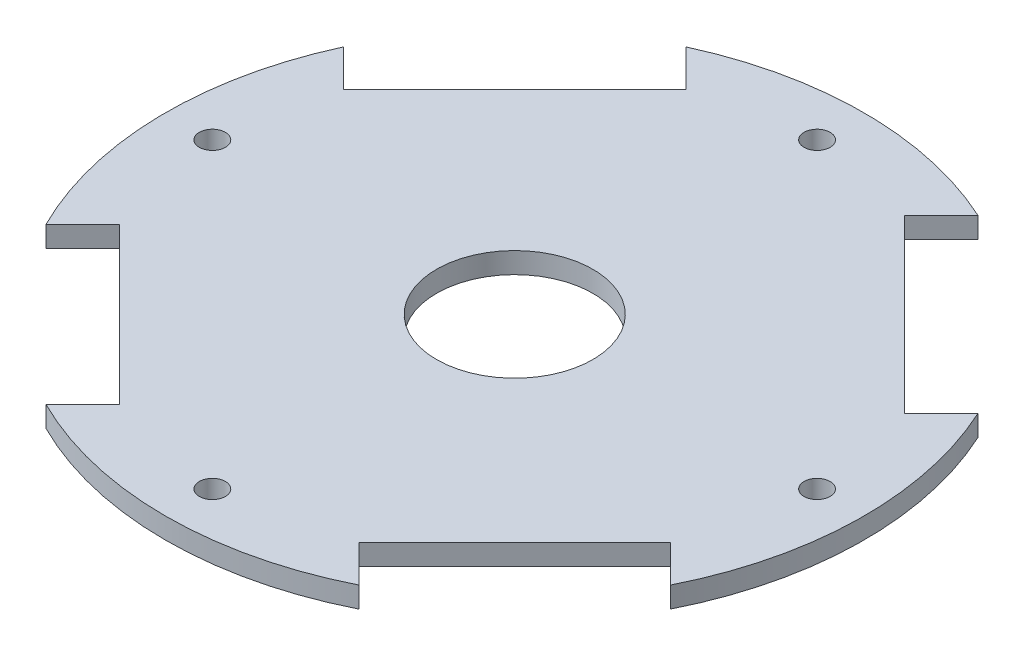
ISO-10303-21;
HEADER;
FILE_DESCRIPTION(('STEP AP214'),'2;1');
FILE_NAME('part.step','',(''),(''),'','','');
FILE_SCHEMA(('AUTOMOTIVE_DESIGN { 1 0 10303 214 1 1 1 1 }'));
ENDSEC;
DATA;
#1=APPLICATION_CONTEXT('core data for automotive mechanical design processes');
#2=APPLICATION_PROTOCOL_DEFINITION('international standard','automotive_design',2000,#1);
#3=PRODUCT_CONTEXT('',#1,'mechanical');
#4=PRODUCT('Part','Part','',(#3));
#5=PRODUCT_RELATED_PRODUCT_CATEGORY('part','',(#4));
#6=PRODUCT_DEFINITION_FORMATION('','',#4);
#7=PRODUCT_DEFINITION_CONTEXT('part definition',#1,'design');
#8=PRODUCT_DEFINITION('design','',#6,#7);
#9=PRODUCT_DEFINITION_SHAPE('','',#8);
#10=(LENGTH_UNIT() NAMED_UNIT(*) SI_UNIT(.MILLI.,.METRE.));
#11=(NAMED_UNIT(*) PLANE_ANGLE_UNIT() SI_UNIT($,.RADIAN.));
#12=(NAMED_UNIT(*) SI_UNIT($,.STERADIAN.) SOLID_ANGLE_UNIT());
#13=UNCERTAINTY_MEASURE_WITH_UNIT(LENGTH_MEASURE(1.E-05),#10,'distance_accuracy_value','');
#14=(GEOMETRIC_REPRESENTATION_CONTEXT(3) GLOBAL_UNCERTAINTY_ASSIGNED_CONTEXT((#13)) GLOBAL_UNIT_ASSIGNED_CONTEXT((#10,
#11,#12)) REPRESENTATION_CONTEXT('',''));
#15=CARTESIAN_POINT('',(0.,0.,0.));
#16=DIRECTION('',(0.,0.,1.));
#17=DIRECTION('',(1.,0.,0.));
#18=AXIS2_PLACEMENT_3D('',#15,#16,#17);
#19=CARTESIAN_POINT('',(0.,4.,0.));
#20=DIRECTION('',(0.,-1.,0.));
#21=DIRECTION('',(0.,0.,-1.));
#22=AXIS2_PLACEMENT_3D('',#19,#20,#21);
#23=CYLINDRICAL_SURFACE('',#22,67.);
#24=CARTESIAN_POINT('',(0.,0.,0.));
#25=DIRECTION('',(0.,1.,0.));
#26=DIRECTION('',(0.,0.,1.));
#27=AXIS2_PLACEMENT_3D('',#24,#25,#26);
#28=CIRCLE('',#27,67.);
#29=CARTESIAN_POINT('',(59.9082632030006,0.,30.));
#30=VERTEX_POINT('',#29);
#31=CARTESIAN_POINT('',(60.868711174132,0.,-28.0000000000006));
#32=VERTEX_POINT('',#31);
#33=EDGE_CURVE('E265',#30,#32,#28,.T.);
#34=ORIENTED_EDGE('',*,*,#33,.T.);
#35=DIRECTION('',(0.,-1.,0.));
#36=VECTOR('',#35,1.);
#37=CARTESIAN_POINT('',(60.868711174132,10.,-28.0000000000006));
#38=LINE('',#37,#36);
#39=CARTESIAN_POINT('',(60.868711174132,4.,-28.0000000000006));
#40=VERTEX_POINT('',#39);
#41=EDGE_CURVE('E211',#40,#32,#38,.T.);
#42=ORIENTED_EDGE('',*,*,#41,.F.);
#43=CARTESIAN_POINT('',(0.,4.,0.));
#44=DIRECTION('',(0.,1.,0.));
#45=DIRECTION('',(0.,0.,1.));
#46=AXIS2_PLACEMENT_3D('',#43,#44,#45);
#47=CIRCLE('',#46,67.);
#48=CARTESIAN_POINT('',(59.9082632030006,4.,30.));
#49=VERTEX_POINT('',#48);
#50=EDGE_CURVE('E11',#49,#40,#47,.T.);
#51=ORIENTED_EDGE('',*,*,#50,.F.);
#52=DIRECTION('',(0.,-1.,0.));
#53=VECTOR('',#52,1.);
#54=CARTESIAN_POINT('',(59.9082632030006,10.,30.));
#55=LINE('',#54,#53);
#56=EDGE_CURVE('E223',#49,#30,#55,.T.);
#57=ORIENTED_EDGE('',*,*,#56,.T.);
#58=EDGE_LOOP('',(#34,#42,#51,#57));
#59=FACE_BOUND('',#58,.T.);
#60=ADVANCED_FACE('F37',(#59),#23,.T.);
#61=CARTESIAN_POINT('',(-30.,4.,59.9082632030006));
#62=VERTEX_POINT('',#61);
#63=CARTESIAN_POINT('',(30.,4.,59.9082632030006));
#64=VERTEX_POINT('',#63);
#65=EDGE_CURVE('E48',#62,#64,#47,.T.);
#66=ORIENTED_EDGE('',*,*,#65,.F.);
#67=DIRECTION('',(0.,-1.,0.));
#68=VECTOR('',#67,1.);
#69=CARTESIAN_POINT('',(-30.,10.,59.9082632030006));
#70=LINE('',#69,#68);
#71=CARTESIAN_POINT('',(-30.,0.,59.9082632030006));
#72=VERTEX_POINT('',#71);
#73=EDGE_CURVE('E195',#62,#72,#70,.T.);
#74=ORIENTED_EDGE('',*,*,#73,.T.);
#75=CARTESIAN_POINT('',(30.,0.,59.9082632030006));
#76=VERTEX_POINT('',#75);
#77=EDGE_CURVE('E41',#72,#76,#28,.T.);
#78=ORIENTED_EDGE('',*,*,#77,.T.);
#79=DIRECTION('',(0.,-1.,0.));
#80=VECTOR('',#79,1.);
#81=CARTESIAN_POINT('',(30.,10.,59.9082632030006));
#82=LINE('',#81,#80);
#83=EDGE_CURVE('E222',#64,#76,#82,.T.);
#84=ORIENTED_EDGE('',*,*,#83,.F.);
#85=EDGE_LOOP('',(#66,#74,#78,#84));
#86=FACE_BOUND('',#85,.T.);
#87=ADVANCED_FACE('F349',(#86),#23,.T.);
#88=CARTESIAN_POINT('',(-60.8687111741334,0.,-27.9999999999987));
#89=VERTEX_POINT('',#88);
#90=CARTESIAN_POINT('',(-59.9082632030006,0.,30.));
#91=VERTEX_POINT('',#90);
#92=EDGE_CURVE('E181',#89,#91,#28,.T.);
#93=ORIENTED_EDGE('',*,*,#92,.T.);
#94=DIRECTION('',(0.,-1.,0.));
#95=VECTOR('',#94,1.);
#96=CARTESIAN_POINT('',(-59.9082632030006,10.,30.));
#97=LINE('',#96,#95);
#98=CARTESIAN_POINT('',(-59.9082632030006,4.,30.));
#99=VERTEX_POINT('',#98);
#100=EDGE_CURVE('E63',#99,#91,#97,.T.);
#101=ORIENTED_EDGE('',*,*,#100,.F.);
#102=CARTESIAN_POINT('',(-60.8687111741334,4.,-27.9999999999987));
#103=VERTEX_POINT('',#102);
#104=EDGE_CURVE('E275',#103,#99,#47,.T.);
#105=ORIENTED_EDGE('',*,*,#104,.F.);
#106=DIRECTION('',(0.,-1.,0.));
#107=VECTOR('',#106,1.);
#108=CARTESIAN_POINT('',(-60.8687111741334,10.,-27.9999999999987));
#109=LINE('',#108,#107);
#110=EDGE_CURVE('E175',#103,#89,#109,.T.);
#111=ORIENTED_EDGE('',*,*,#110,.T.);
#112=EDGE_LOOP('',(#93,#101,#105,#111));
#113=FACE_BOUND('',#112,.T.);
#114=ADVANCED_FACE('F313',(#113),#23,.T.);
#115=CARTESIAN_POINT('',(2.23779328401008E-12,4.,-58.0000000000016));
#116=DIRECTION('',(0.,-1.,0.));
#117=DIRECTION('',(0.,0.,-1.));
#118=AXIS2_PLACEMENT_3D('',#115,#116,#117);
#119=CYLINDRICAL_SURFACE('',#118,2.49999999999738);
#120=CARTESIAN_POINT('',(2.23779328401008E-12,4.,-58.0000000000016));
#121=DIRECTION('',(0.,1.,0.));
#122=DIRECTION('',(0.,0.,1.));
#123=AXIS2_PLACEMENT_3D('',#120,#121,#122);
#124=CIRCLE('',#123,2.49999999999738);
#125=CARTESIAN_POINT('',(2.23779328401008E-12,4.,-55.5000000000043));
#126=VERTEX_POINT('',#125);
#127=EDGE_CURVE('E271',#126,#126,#124,.T.);
#128=ORIENTED_EDGE('',*,*,#127,.T.);
#129=EDGE_LOOP('',(#128));
#130=FACE_BOUND('',#129,.T.);
#131=CARTESIAN_POINT('',(2.23779328401008E-12,0.,-58.0000000000016));
#132=DIRECTION('',(0.,1.,0.));
#133=DIRECTION('',(0.,0.,1.));
#134=AXIS2_PLACEMENT_3D('',#131,#132,#133);
#135=CIRCLE('',#134,2.49999999999738);
#136=CARTESIAN_POINT('',(2.23779328401008E-12,0.,-55.5000000000043));
#137=VERTEX_POINT('',#136);
#138=EDGE_CURVE('E283',#137,#137,#135,.T.);
#139=ORIENTED_EDGE('',*,*,#138,.F.);
#140=EDGE_LOOP('',(#139));
#141=FACE_BOUND('',#140,.T.);
#142=ADVANCED_FACE('F382',(#130,#141),#119,.F.);
#143=CARTESIAN_POINT('',(58.0000000000033,4.,6.00214322687975E-13));
#144=DIRECTION('',(0.,-1.,0.));
#145=DIRECTION('',(0.,0.,-1.));
#146=AXIS2_PLACEMENT_3D('',#143,#144,#145);
#147=CYLINDRICAL_SURFACE('',#146,2.49999999999867);
#148=CARTESIAN_POINT('',(58.0000000000033,4.,6.00214322687975E-13));
#149=DIRECTION('',(0.,1.,0.));
#150=DIRECTION('',(0.,0.,1.));
#151=AXIS2_PLACEMENT_3D('',#148,#149,#150);
#152=CIRCLE('',#151,2.49999999999867);
#153=CARTESIAN_POINT('',(58.0000000000033,4.,2.49999999999927));
#154=VERTEX_POINT('',#153);
#155=EDGE_CURVE('E268',#154,#154,#152,.T.);
#156=ORIENTED_EDGE('',*,*,#155,.T.);
#157=EDGE_LOOP('',(#156));
#158=FACE_BOUND('',#157,.T.);
#159=CARTESIAN_POINT('',(58.0000000000033,0.,6.00214322687975E-13));
#160=DIRECTION('',(0.,1.,0.));
#161=DIRECTION('',(0.,0.,1.));
#162=AXIS2_PLACEMENT_3D('',#159,#160,#161);
#163=CIRCLE('',#162,2.49999999999867);
#164=CARTESIAN_POINT('',(58.0000000000033,0.,2.49999999999927));
#165=VERTEX_POINT('',#164);
#166=EDGE_CURVE('E281',#165,#165,#163,.T.);
#167=ORIENTED_EDGE('',*,*,#166,.F.);
#168=EDGE_LOOP('',(#167));
#169=FACE_BOUND('',#168,.T.);
#170=ADVANCED_FACE('F386',(#158,#169),#147,.F.);
#171=CARTESIAN_POINT('',(1.03736463863413E-12,4.,58.0000000000016));
#172=DIRECTION('',(0.,-1.,0.));
#173=DIRECTION('',(0.,0.,-1.));
#174=AXIS2_PLACEMENT_3D('',#171,#172,#173);
#175=CYLINDRICAL_SURFACE('',#174,2.5000000000009);
#176=CARTESIAN_POINT('',(1.03736463863413E-12,4.,58.0000000000016));
#177=DIRECTION('',(0.,1.,0.));
#178=DIRECTION('',(0.,0.,1.));
#179=AXIS2_PLACEMENT_3D('',#176,#177,#178);
#180=CIRCLE('',#179,2.5000000000009);
#181=CARTESIAN_POINT('',(1.03736463863413E-12,4.,60.5000000000025));
#182=VERTEX_POINT('',#181);
#183=EDGE_CURVE('E264',#182,#182,#180,.T.);
#184=ORIENTED_EDGE('',*,*,#183,.T.);
#185=EDGE_LOOP('',(#184));
#186=FACE_BOUND('',#185,.T.);
#187=CARTESIAN_POINT('',(1.03736463863413E-12,0.,58.0000000000016));
#188=DIRECTION('',(0.,1.,0.));
#189=DIRECTION('',(0.,0.,1.));
#190=AXIS2_PLACEMENT_3D('',#187,#188,#189);
#191=CIRCLE('',#190,2.5000000000009);
#192=CARTESIAN_POINT('',(1.03736463863413E-12,0.,60.5000000000025));
#193=VERTEX_POINT('',#192);
#194=EDGE_CURVE('E278',#193,#193,#191,.T.);
#195=ORIENTED_EDGE('',*,*,#194,.F.);
#196=EDGE_LOOP('',(#195));
#197=FACE_BOUND('',#196,.T.);
#198=ADVANCED_FACE('F380',(#186,#197),#175,.F.);
#199=CARTESIAN_POINT('',(-58.,4.,-6.07153216591882E-13));
#200=DIRECTION('',(0.,-1.,0.));
#201=DIRECTION('',(0.,0.,-1.));
#202=AXIS2_PLACEMENT_3D('',#199,#200,#201);
#203=CYLINDRICAL_SURFACE('',#202,2.5);
#204=CARTESIAN_POINT('',(-58.,4.,-6.07153216591882E-13));
#205=DIRECTION('',(0.,1.,0.));
#206=DIRECTION('',(0.,0.,1.));
#207=AXIS2_PLACEMENT_3D('',#204,#205,#206);
#208=CIRCLE('',#207,2.5);
#209=CARTESIAN_POINT('',(-58.,4.,2.49999999999939));
#210=VERTEX_POINT('',#209);
#211=EDGE_CURVE('E261',#210,#210,#208,.T.);
#212=ORIENTED_EDGE('',*,*,#211,.T.);
#213=EDGE_LOOP('',(#212));
#214=FACE_BOUND('',#213,.T.);
#215=CARTESIAN_POINT('',(-58.,0.,-6.07153216591882E-13));
#216=DIRECTION('',(0.,1.,0.));
#217=DIRECTION('',(0.,0.,1.));
#218=AXIS2_PLACEMENT_3D('',#215,#216,#217);
#219=CIRCLE('',#218,2.5);
#220=CARTESIAN_POINT('',(-58.,0.,2.49999999999939));
#221=VERTEX_POINT('',#220);
#222=EDGE_CURVE('E258',#221,#221,#219,.T.);
#223=ORIENTED_EDGE('',*,*,#222,.F.);
#224=EDGE_LOOP('',(#223));
#225=FACE_BOUND('',#224,.T.);
#226=ADVANCED_FACE('F39',(#214,#225),#203,.F.);
#227=CARTESIAN_POINT('',(27.9999999999987,4.,-60.8687111741334));
#228=VERTEX_POINT('',#227);
#229=CARTESIAN_POINT('',(-28.0000000000013,4.,-60.8687111741322));
#230=VERTEX_POINT('',#229);
#231=EDGE_CURVE('E46',#228,#230,#47,.T.);
#232=ORIENTED_EDGE('',*,*,#231,.F.);
#233=DIRECTION('',(0.,-1.,0.));
#234=VECTOR('',#233,1.);
#235=CARTESIAN_POINT('',(27.9999999999987,10.,-60.8687111741334));
#236=LINE('',#235,#234);
#237=CARTESIAN_POINT('',(27.9999999999987,0.,-60.8687111741334));
#238=VERTEX_POINT('',#237);
#239=EDGE_CURVE('E208',#228,#238,#236,.T.);
#240=ORIENTED_EDGE('',*,*,#239,.T.);
#241=CARTESIAN_POINT('',(-28.0000000000013,0.,-60.8687111741322));
#242=VERTEX_POINT('',#241);
#243=EDGE_CURVE('E291',#238,#242,#28,.T.);
#244=ORIENTED_EDGE('',*,*,#243,.T.);
#245=DIRECTION('',(0.,-1.,0.));
#246=VECTOR('',#245,1.);
#247=CARTESIAN_POINT('',(-28.0000000000013,10.,-60.8687111741322));
#248=LINE('',#247,#246);
#249=EDGE_CURVE('E302',#230,#242,#248,.T.);
#250=ORIENTED_EDGE('',*,*,#249,.F.);
#251=EDGE_LOOP('',(#232,#240,#244,#250));
#252=FACE_BOUND('',#251,.T.);
#253=ADVANCED_FACE('F301',(#252),#23,.T.);
#254=CARTESIAN_POINT('',(0.,4.,0.));
#255=DIRECTION('',(0.,1.,0.));
#256=DIRECTION('',(0.,0.,1.));
#257=AXIS2_PLACEMENT_3D('',#254,#255,#256);
#258=PLANE('',#257);
#259=DIRECTION('',(0.707106781186501,0.,-0.707106781186594));
#260=VECTOR('',#259,1.);
#261=CARTESIAN_POINT('',(16.4343555870696,4.,16.4343555870674));
#262=LINE('',#261,#260);
#263=CARTESIAN_POINT('',(53.7976433622672,4.,-20.9289321881351));
#264=VERTEX_POINT('',#263);
#265=EDGE_CURVE('E252',#264,#40,#262,.T.);
#266=ORIENTED_EDGE('',*,*,#265,.F.);
#267=DIRECTION('',(0.707106781186547,0.,0.707106781186548));
#268=VECTOR('',#267,1.);
#269=CARTESIAN_POINT('',(37.3632877752012,4.,-37.3632877752011));
#270=LINE('',#269,#268);
#271=CARTESIAN_POINT('',(20.9289321881338,4.,-53.7976433622685));
#272=VERTEX_POINT('',#271);
#273=EDGE_CURVE('E248',#272,#264,#270,.T.);
#274=ORIENTED_EDGE('',*,*,#273,.F.);
#275=DIRECTION('',(-0.707106781186547,0.,0.707106781186548));
#276=VECTOR('',#275,1.);
#277=CARTESIAN_POINT('',(-16.4343555870673,4.,-16.4343555870673));
#278=LINE('',#277,#276);
#279=EDGE_CURVE('E250',#228,#272,#278,.T.);
#280=ORIENTED_EDGE('',*,*,#279,.F.);
#281=ORIENTED_EDGE('',*,*,#231,.T.);
#282=DIRECTION('',(-0.707106781186562,0.,-0.707106781186533));
#283=VECTOR('',#282,1.);
#284=CARTESIAN_POINT('',(16.434355587066,4.,-16.4343555870667));
#285=LINE('',#284,#283);
#286=CARTESIAN_POINT('',(-20.9289321881357,4.,-53.7976433622669));
#287=VERTEX_POINT('',#286);
#288=EDGE_CURVE('E237',#287,#230,#285,.T.);
#289=ORIENTED_EDGE('',*,*,#288,.F.);
#290=DIRECTION('',(0.707106781186547,0.,-0.707106781186548));
#291=VECTOR('',#290,1.);
#292=CARTESIAN_POINT('',(-37.3632877752013,4.,-37.3632877752013));
#293=LINE('',#292,#291);
#294=CARTESIAN_POINT('',(-53.7976433622686,4.,-20.9289321881339));
#295=VERTEX_POINT('',#294);
#296=EDGE_CURVE('E239',#295,#287,#293,.T.);
#297=ORIENTED_EDGE('',*,*,#296,.F.);
#298=DIRECTION('',(0.707106781186548,0.,0.707106781186548));
#299=VECTOR('',#298,1.);
#300=CARTESIAN_POINT('',(-16.4343555870673,4.,16.4343555870673));
#301=LINE('',#300,#299);
#302=EDGE_CURVE('E161',#103,#295,#301,.T.);
#303=ORIENTED_EDGE('',*,*,#302,.F.);
#304=ORIENTED_EDGE('',*,*,#104,.T.);
#305=DIRECTION('',(-0.707106781186548,0.,0.707106781186548));
#306=VECTOR('',#305,1.);
#307=CARTESIAN_POINT('',(-14.9541316015003,4.,-14.9541316015003));
#308=LINE('',#307,#306);
#309=CARTESIAN_POINT('',(-52.8371953911352,4.,22.9289321881345));
#310=VERTEX_POINT('',#309);
#311=EDGE_CURVE('E242',#310,#99,#308,.T.);
#312=ORIENTED_EDGE('',*,*,#311,.F.);
#313=DIRECTION('',(-0.707106781186548,0.,-0.707106781186547));
#314=VECTOR('',#313,1.);
#315=CARTESIAN_POINT('',(-37.8830637896348,4.,37.8830637896349));
#316=LINE('',#315,#314);
#317=CARTESIAN_POINT('',(-22.9289321881345,4.,52.8371953911352));
#318=VERTEX_POINT('',#317);
#319=EDGE_CURVE('E244',#318,#310,#316,.T.);
#320=ORIENTED_EDGE('',*,*,#319,.F.);
#321=DIRECTION('',(0.707106781186548,0.,-0.707106781186547));
#322=VECTOR('',#321,1.);
#323=CARTESIAN_POINT('',(14.9541316015003,4.,14.9541316015003));
#324=LINE('',#323,#322);
#325=EDGE_CURVE('E246',#62,#318,#324,.T.);
#326=ORIENTED_EDGE('',*,*,#325,.F.);
#327=ORIENTED_EDGE('',*,*,#65,.T.);
#328=DIRECTION('',(0.707106781186547,0.,0.707106781186548));
#329=VECTOR('',#328,1.);
#330=CARTESIAN_POINT('',(-14.9541316015003,4.,14.9541316015003));
#331=LINE('',#330,#329);
#332=CARTESIAN_POINT('',(22.9289321881345,4.,52.8371953911352));
#333=VERTEX_POINT('',#332);
#334=EDGE_CURVE('E226',#333,#64,#331,.T.);
#335=ORIENTED_EDGE('',*,*,#334,.F.);
#336=DIRECTION('',(-0.707106781186548,0.,0.707106781186548));
#337=VECTOR('',#336,1.);
#338=CARTESIAN_POINT('',(37.8830637896348,4.,37.8830637896348));
#339=LINE('',#338,#337);
#340=CARTESIAN_POINT('',(52.8371953911352,4.,22.9289321881345));
#341=VERTEX_POINT('',#340);
#342=EDGE_CURVE('E233',#341,#333,#339,.T.);
#343=ORIENTED_EDGE('',*,*,#342,.F.);
#344=DIRECTION('',(-0.707106781186548,0.,-0.707106781186548));
#345=VECTOR('',#344,1.);
#346=CARTESIAN_POINT('',(14.9541316015003,4.,-14.9541316015003));
#347=LINE('',#346,#345);
#348=EDGE_CURVE('E235',#49,#341,#347,.T.);
#349=ORIENTED_EDGE('',*,*,#348,.F.);
#350=ORIENTED_EDGE('',*,*,#50,.T.);
#351=EDGE_LOOP('',(#266,#274,#280,#281,#289,#297,#303,#304,#312,#320,#326,#327,#335,#343,#349,#350));
#352=FACE_BOUND('',#351,.T.);
#353=CARTESIAN_POINT('',(0.,4.,0.));
#354=DIRECTION('',(0.,1.,0.));
#355=DIRECTION('',(0.,0.,1.));
#356=AXIS2_PLACEMENT_3D('',#353,#354,#355);
#357=CIRCLE('',#356,15.);
#358=CARTESIAN_POINT('',(0.,4.,15.));
#359=VERTEX_POINT('',#358);
#360=EDGE_CURVE('E254',#359,#359,#357,.T.);
#361=ORIENTED_EDGE('',*,*,#360,.F.);
#362=EDGE_LOOP('',(#361));
#363=FACE_BOUND('',#362,.T.);
#364=ORIENTED_EDGE('',*,*,#211,.F.);
#365=EDGE_LOOP('',(#364));
#366=FACE_BOUND('',#365,.T.);
#367=ORIENTED_EDGE('',*,*,#183,.F.);
#368=EDGE_LOOP('',(#367));
#369=FACE_BOUND('',#368,.T.);
#370=ORIENTED_EDGE('',*,*,#155,.F.);
#371=EDGE_LOOP('',(#370));
#372=FACE_BOUND('',#371,.T.);
#373=ORIENTED_EDGE('',*,*,#127,.F.);
#374=EDGE_LOOP('',(#373));
#375=FACE_BOUND('',#374,.T.);
#376=ADVANCED_FACE('F317',(#352,#363,#366,#369,#372,#375),#258,.T.);
#377=CARTESIAN_POINT('',(0.,0.,0.));
#378=DIRECTION('',(0.,1.,0.));
#379=DIRECTION('',(0.,0.,1.));
#380=AXIS2_PLACEMENT_3D('',#377,#378,#379);
#381=PLANE('',#380);
#382=CARTESIAN_POINT('',(0.,0.,0.));
#383=DIRECTION('',(0.,1.,0.));
#384=DIRECTION('',(0.,0.,1.));
#385=AXIS2_PLACEMENT_3D('',#382,#383,#384);
#386=CIRCLE('',#385,15.);
#387=CARTESIAN_POINT('',(0.,0.,15.));
#388=VERTEX_POINT('',#387);
#389=EDGE_CURVE('E255',#388,#388,#386,.T.);
#390=ORIENTED_EDGE('',*,*,#389,.T.);
#391=EDGE_LOOP('',(#390));
#392=FACE_BOUND('',#391,.T.);
#393=ORIENTED_EDGE('',*,*,#222,.T.);
#394=EDGE_LOOP('',(#393));
#395=FACE_BOUND('',#394,.T.);
#396=ORIENTED_EDGE('',*,*,#194,.T.);
#397=EDGE_LOOP('',(#396));
#398=FACE_BOUND('',#397,.T.);
#399=ORIENTED_EDGE('',*,*,#166,.T.);
#400=EDGE_LOOP('',(#399));
#401=FACE_BOUND('',#400,.T.);
#402=ORIENTED_EDGE('',*,*,#138,.T.);
#403=EDGE_LOOP('',(#402));
#404=FACE_BOUND('',#403,.T.);
#405=DIRECTION('',(-0.707106781186547,0.,-0.707106781186548));
#406=VECTOR('',#405,1.);
#407=CARTESIAN_POINT('',(53.7976433622672,0.,-20.9289321881351));
#408=LINE('',#407,#406);
#409=CARTESIAN_POINT('',(53.7976433622672,0.,-20.9289321881351));
#410=VERTEX_POINT('',#409);
#411=CARTESIAN_POINT('',(20.9289321881338,0.,-53.7976433622685));
#412=VERTEX_POINT('',#411);
#413=EDGE_CURVE('E214',#410,#412,#408,.T.);
#414=ORIENTED_EDGE('',*,*,#413,.F.);
#415=DIRECTION('',(-0.707106781186501,0.,0.707106781186594));
#416=VECTOR('',#415,1.);
#417=CARTESIAN_POINT('',(60.8687111741316,0.,-28.0000000000005));
#418=LINE('',#417,#416);
#419=EDGE_CURVE('E55',#32,#410,#418,.T.);
#420=ORIENTED_EDGE('',*,*,#419,.F.);
#421=ORIENTED_EDGE('',*,*,#33,.F.);
#422=DIRECTION('',(0.707106781186547,0.,0.707106781186547));
#423=VECTOR('',#422,1.);
#424=CARTESIAN_POINT('',(59.9082632030006,0.,30.));
#425=LINE('',#424,#423);
#426=CARTESIAN_POINT('',(52.8371953911352,0.,22.9289321881345));
#427=VERTEX_POINT('',#426);
#428=EDGE_CURVE('E220',#427,#30,#425,.T.);
#429=ORIENTED_EDGE('',*,*,#428,.F.);
#430=DIRECTION('',(0.707106781186548,0.,-0.707106781186548));
#431=VECTOR('',#430,1.);
#432=CARTESIAN_POINT('',(52.8371953911352,0.,22.9289321881345));
#433=LINE('',#432,#431);
#434=CARTESIAN_POINT('',(22.9289321881345,0.,52.8371953911352));
#435=VERTEX_POINT('',#434);
#436=EDGE_CURVE('E185',#435,#427,#433,.T.);
#437=ORIENTED_EDGE('',*,*,#436,.F.);
#438=DIRECTION('',(-0.707106781186547,0.,-0.707106781186548));
#439=VECTOR('',#438,1.);
#440=CARTESIAN_POINT('',(30.,0.,59.9082632030006));
#441=LINE('',#440,#439);
#442=EDGE_CURVE('E182',#76,#435,#441,.T.);
#443=ORIENTED_EDGE('',*,*,#442,.F.);
#444=ORIENTED_EDGE('',*,*,#77,.F.);
#445=DIRECTION('',(-0.707106781186548,0.,0.707106781186547));
#446=VECTOR('',#445,1.);
#447=CARTESIAN_POINT('',(-30.,0.,59.9082632030006));
#448=LINE('',#447,#446);
#449=CARTESIAN_POINT('',(-22.9289321881345,0.,52.8371953911352));
#450=VERTEX_POINT('',#449);
#451=EDGE_CURVE('E190',#450,#72,#448,.T.);
#452=ORIENTED_EDGE('',*,*,#451,.F.);
#453=DIRECTION('',(0.707106781186548,0.,0.707106781186547));
#454=VECTOR('',#453,1.);
#455=CARTESIAN_POINT('',(-52.8371953911352,0.,22.9289321881345));
#456=LINE('',#455,#454);
#457=CARTESIAN_POINT('',(-52.8371953911352,0.,22.9289321881345));
#458=VERTEX_POINT('',#457);
#459=EDGE_CURVE('E199',#458,#450,#456,.T.);
#460=ORIENTED_EDGE('',*,*,#459,.F.);
#461=DIRECTION('',(0.707106781186547,0.,-0.707106781186547));
#462=VECTOR('',#461,1.);
#463=CARTESIAN_POINT('',(-59.9082632030006,0.,30.));
#464=LINE('',#463,#462);
#465=EDGE_CURVE('E165',#91,#458,#464,.T.);
#466=ORIENTED_EDGE('',*,*,#465,.F.);
#467=ORIENTED_EDGE('',*,*,#92,.F.);
#468=DIRECTION('',(-0.707106781186548,0.,-0.707106781186548));
#469=VECTOR('',#468,1.);
#470=CARTESIAN_POINT('',(-60.8687111741334,0.,-27.9999999999987));
#471=LINE('',#470,#469);
#472=CARTESIAN_POINT('',(-53.7976433622686,0.,-20.9289321881339));
#473=VERTEX_POINT('',#472);
#474=EDGE_CURVE('E158',#473,#89,#471,.T.);
#475=ORIENTED_EDGE('',*,*,#474,.F.);
#476=DIRECTION('',(-0.707106781186547,0.,0.707106781186548));
#477=VECTOR('',#476,1.);
#478=CARTESIAN_POINT('',(-53.7976433622686,0.,-20.9289321881339));
#479=LINE('',#478,#477);
#480=CARTESIAN_POINT('',(-20.9289321881357,0.,-53.7976433622669));
#481=VERTEX_POINT('',#480);
#482=EDGE_CURVE('E168',#481,#473,#479,.T.);
#483=ORIENTED_EDGE('',*,*,#482,.F.);
#484=DIRECTION('',(0.707106781186562,0.,0.707106781186533));
#485=VECTOR('',#484,1.);
#486=CARTESIAN_POINT('',(-28.0000000000013,0.,-60.8687111741322));
#487=LINE('',#486,#485);
#488=EDGE_CURVE('E174',#242,#481,#487,.T.);
#489=ORIENTED_EDGE('',*,*,#488,.F.);
#490=ORIENTED_EDGE('',*,*,#243,.F.);
#491=DIRECTION('',(0.707106781186547,0.,-0.707106781186548));
#492=VECTOR('',#491,1.);
#493=CARTESIAN_POINT('',(27.9999999999987,0.,-60.8687111741334));
#494=LINE('',#493,#492);
#495=EDGE_CURVE('E205',#412,#238,#494,.T.);
#496=ORIENTED_EDGE('',*,*,#495,.F.);
#497=EDGE_LOOP('',(#414,#420,#421,#429,#437,#443,#444,#452,#460,#466,#467,#475,#483,#489,#490,#496));
#498=FACE_BOUND('',#497,.T.);
#499=ADVANCED_FACE('F179',(#392,#395,#398,#401,#404,#498),#381,.F.);
#500=CARTESIAN_POINT('',(0.,0.,0.));
#501=DIRECTION('',(0.,1.,0.));
#502=DIRECTION('',(0.,0.,1.));
#503=AXIS2_PLACEMENT_3D('',#500,#501,#502);
#504=CYLINDRICAL_SURFACE('',#503,15.);
#505=ORIENTED_EDGE('',*,*,#389,.F.);
#506=EDGE_LOOP('',(#505));
#507=FACE_BOUND('',#506,.T.);
#508=ORIENTED_EDGE('',*,*,#360,.T.);
#509=EDGE_LOOP('',(#508));
#510=FACE_BOUND('',#509,.T.);
#511=ADVANCED_FACE('F404',(#507,#510),#504,.F.);
#512=CARTESIAN_POINT('',(59.9082632030006,10.,30.));
#513=DIRECTION('',(0.707106781186548,0.,-0.707106781186548));
#514=DIRECTION('',(-0.707106781186548,0.,-0.707106781186548));
#515=AXIS2_PLACEMENT_3D('',#512,#513,#514);
#516=PLANE('',#515);
#517=ORIENTED_EDGE('',*,*,#348,.T.);
#518=DIRECTION('',(0.,-1.,0.));
#519=VECTOR('',#518,1.);
#520=CARTESIAN_POINT('',(52.8371953911352,10.,22.9289321881345));
#521=LINE('',#520,#519);
#522=EDGE_CURVE('E227',#341,#427,#521,.T.);
#523=ORIENTED_EDGE('',*,*,#522,.T.);
#524=ORIENTED_EDGE('',*,*,#428,.T.);
#525=ORIENTED_EDGE('',*,*,#56,.F.);
#526=EDGE_LOOP('',(#517,#523,#524,#525));
#527=FACE_BOUND('',#526,.T.);
#528=ADVANCED_FACE('F331',(#527),#516,.F.);
#529=CARTESIAN_POINT('',(52.8371953911352,10.,22.9289321881345));
#530=DIRECTION('',(-0.707106781186548,0.,-0.707106781186548));
#531=DIRECTION('',(-0.707106781186548,0.,0.707106781186548));
#532=AXIS2_PLACEMENT_3D('',#529,#530,#531);
#533=PLANE('',#532);
#534=ORIENTED_EDGE('',*,*,#342,.T.);
#535=DIRECTION('',(0.,-1.,0.));
#536=VECTOR('',#535,1.);
#537=CARTESIAN_POINT('',(22.9289321881345,10.,52.8371953911352));
#538=LINE('',#537,#536);
#539=EDGE_CURVE('E229',#333,#435,#538,.T.);
#540=ORIENTED_EDGE('',*,*,#539,.T.);
#541=ORIENTED_EDGE('',*,*,#436,.T.);
#542=ORIENTED_EDGE('',*,*,#522,.F.);
#543=EDGE_LOOP('',(#534,#540,#541,#542));
#544=FACE_BOUND('',#543,.T.);
#545=ADVANCED_FACE('F338',(#544),#533,.F.);
#546=CARTESIAN_POINT('',(30.,10.,59.9082632030006));
#547=DIRECTION('',(-0.707106781186548,0.,0.707106781186547));
#548=DIRECTION('',(0.707106781186547,0.,0.707106781186548));
#549=AXIS2_PLACEMENT_3D('',#546,#547,#548);
#550=PLANE('',#549);
#551=ORIENTED_EDGE('',*,*,#334,.T.);
#552=ORIENTED_EDGE('',*,*,#83,.T.);
#553=ORIENTED_EDGE('',*,*,#442,.T.);
#554=ORIENTED_EDGE('',*,*,#539,.F.);
#555=EDGE_LOOP('',(#551,#552,#553,#554));
#556=FACE_BOUND('',#555,.T.);
#557=ADVANCED_FACE('F341',(#556),#550,.F.);
#558=CARTESIAN_POINT('',(-60.8687111741334,10.,-27.9999999999987));
#559=DIRECTION('',(-0.707106781186548,0.,0.707106781186548));
#560=DIRECTION('',(0.707106781186548,0.,0.707106781186548));
#561=AXIS2_PLACEMENT_3D('',#558,#559,#560);
#562=PLANE('',#561);
#563=ORIENTED_EDGE('',*,*,#302,.T.);
#564=DIRECTION('',(0.,-1.,0.));
#565=VECTOR('',#564,1.);
#566=CARTESIAN_POINT('',(-53.7976433622686,10.,-20.9289321881339));
#567=LINE('',#566,#565);
#568=EDGE_CURVE('E154',#295,#473,#567,.T.);
#569=ORIENTED_EDGE('',*,*,#568,.T.);
#570=ORIENTED_EDGE('',*,*,#474,.T.);
#571=ORIENTED_EDGE('',*,*,#110,.F.);
#572=EDGE_LOOP('',(#563,#569,#570,#571));
#573=FACE_BOUND('',#572,.T.);
#574=ADVANCED_FACE('F156',(#573),#562,.F.);
#575=CARTESIAN_POINT('',(-53.7976433622686,10.,-20.9289321881339));
#576=DIRECTION('',(0.707106781186548,0.,0.707106781186547));
#577=DIRECTION('',(0.707106781186547,0.,-0.707106781186548));
#578=AXIS2_PLACEMENT_3D('',#575,#576,#577);
#579=PLANE('',#578);
#580=ORIENTED_EDGE('',*,*,#296,.T.);
#581=DIRECTION('',(0.,-1.,0.));
#582=VECTOR('',#581,1.);
#583=CARTESIAN_POINT('',(-20.9289321881357,10.,-53.7976433622669));
#584=LINE('',#583,#582);
#585=EDGE_CURVE('E164',#287,#481,#584,.T.);
#586=ORIENTED_EDGE('',*,*,#585,.T.);
#587=ORIENTED_EDGE('',*,*,#482,.T.);
#588=ORIENTED_EDGE('',*,*,#568,.F.);
#589=EDGE_LOOP('',(#580,#586,#587,#588));
#590=FACE_BOUND('',#589,.T.);
#591=ADVANCED_FACE('F169',(#590),#579,.F.);
#592=CARTESIAN_POINT('',(-28.0000000000013,10.,-60.8687111741322));
#593=DIRECTION('',(0.707106781186533,0.,-0.707106781186562));
#594=DIRECTION('',(-0.707106781186562,0.,-0.707106781186533));
#595=AXIS2_PLACEMENT_3D('',#592,#593,#594);
#596=PLANE('',#595);
#597=ORIENTED_EDGE('',*,*,#288,.T.);
#598=ORIENTED_EDGE('',*,*,#249,.T.);
#599=ORIENTED_EDGE('',*,*,#488,.T.);
#600=ORIENTED_EDGE('',*,*,#585,.F.);
#601=EDGE_LOOP('',(#597,#598,#599,#600));
#602=FACE_BOUND('',#601,.T.);
#603=ADVANCED_FACE('F306',(#602),#596,.F.);
#604=CARTESIAN_POINT('',(-30.,10.,59.9082632030006));
#605=DIRECTION('',(0.707106781186547,0.,0.707106781186548));
#606=DIRECTION('',(0.707106781186548,0.,-0.707106781186547));
#607=AXIS2_PLACEMENT_3D('',#604,#605,#606);
#608=PLANE('',#607);
#609=ORIENTED_EDGE('',*,*,#325,.T.);
#610=DIRECTION('',(0.,-1.,0.));
#611=VECTOR('',#610,1.);
#612=CARTESIAN_POINT('',(-22.9289321881345,10.,52.8371953911352));
#613=LINE('',#612,#611);
#614=EDGE_CURVE('E193',#318,#450,#613,.T.);
#615=ORIENTED_EDGE('',*,*,#614,.T.);
#616=ORIENTED_EDGE('',*,*,#451,.T.);
#617=ORIENTED_EDGE('',*,*,#73,.F.);
#618=EDGE_LOOP('',(#609,#615,#616,#617));
#619=FACE_BOUND('',#618,.T.);
#620=ADVANCED_FACE('F345',(#619),#608,.F.);
#621=CARTESIAN_POINT('',(-52.8371953911352,10.,22.9289321881345));
#622=DIRECTION('',(0.707106781186547,0.,-0.707106781186548));
#623=DIRECTION('',(-0.707106781186548,0.,-0.707106781186547));
#624=AXIS2_PLACEMENT_3D('',#621,#622,#623);
#625=PLANE('',#624);
#626=ORIENTED_EDGE('',*,*,#319,.T.);
#627=DIRECTION('',(0.,-1.,0.));
#628=VECTOR('',#627,1.);
#629=CARTESIAN_POINT('',(-52.8371953911352,10.,22.9289321881345));
#630=LINE('',#629,#628);
#631=EDGE_CURVE('E191',#310,#458,#630,.T.);
#632=ORIENTED_EDGE('',*,*,#631,.T.);
#633=ORIENTED_EDGE('',*,*,#459,.T.);
#634=ORIENTED_EDGE('',*,*,#614,.F.);
#635=EDGE_LOOP('',(#626,#632,#633,#634));
#636=FACE_BOUND('',#635,.T.);
#637=ADVANCED_FACE('F352',(#636),#625,.F.);
#638=CARTESIAN_POINT('',(-59.9082632030006,10.,30.));
#639=DIRECTION('',(-0.707106781186548,0.,-0.707106781186548));
#640=DIRECTION('',(-0.707106781186548,0.,0.707106781186548));
#641=AXIS2_PLACEMENT_3D('',#638,#639,#640);
#642=PLANE('',#641);
#643=ORIENTED_EDGE('',*,*,#311,.T.);
#644=ORIENTED_EDGE('',*,*,#100,.T.);
#645=ORIENTED_EDGE('',*,*,#465,.T.);
#646=ORIENTED_EDGE('',*,*,#631,.F.);
#647=EDGE_LOOP('',(#643,#644,#645,#646));
#648=FACE_BOUND('',#647,.T.);
#649=ADVANCED_FACE('F354',(#648),#642,.F.);
#650=CARTESIAN_POINT('',(60.8687111741316,10.,-28.0000000000005));
#651=DIRECTION('',(0.707106781186594,0.,0.707106781186501));
#652=DIRECTION('',(0.707106781186501,0.,-0.707106781186594));
#653=AXIS2_PLACEMENT_3D('',#650,#651,#652);
#654=PLANE('',#653);
#655=ORIENTED_EDGE('',*,*,#265,.T.);
#656=ORIENTED_EDGE('',*,*,#41,.T.);
#657=ORIENTED_EDGE('',*,*,#419,.T.);
#658=DIRECTION('',(0.,-1.,0.));
#659=VECTOR('',#658,1.);
#660=CARTESIAN_POINT('',(53.7976433622672,10.,-20.9289321881351));
#661=LINE('',#660,#659);
#662=EDGE_CURVE('E203',#264,#410,#661,.T.);
#663=ORIENTED_EDGE('',*,*,#662,.F.);
#664=EDGE_LOOP('',(#655,#656,#657,#663));
#665=FACE_BOUND('',#664,.T.);
#666=ADVANCED_FACE('F356',(#665),#654,.F.);
#667=CARTESIAN_POINT('',(27.9999999999987,10.,-60.8687111741334));
#668=DIRECTION('',(-0.707106781186548,0.,-0.707106781186547));
#669=DIRECTION('',(-0.707106781186547,0.,0.707106781186548));
#670=AXIS2_PLACEMENT_3D('',#667,#668,#669);
#671=PLANE('',#670);
#672=ORIENTED_EDGE('',*,*,#279,.T.);
#673=DIRECTION('',(0.,-1.,0.));
#674=VECTOR('',#673,1.);
#675=CARTESIAN_POINT('',(20.9289321881338,10.,-53.7976433622685));
#676=LINE('',#675,#674);
#677=EDGE_CURVE('E206',#272,#412,#676,.T.);
#678=ORIENTED_EDGE('',*,*,#677,.T.);
#679=ORIENTED_EDGE('',*,*,#495,.T.);
#680=ORIENTED_EDGE('',*,*,#239,.F.);
#681=EDGE_LOOP('',(#672,#678,#679,#680));
#682=FACE_BOUND('',#681,.T.);
#683=ADVANCED_FACE('F324',(#682),#671,.F.);
#684=CARTESIAN_POINT('',(53.7976433622672,10.,-20.9289321881351));
#685=DIRECTION('',(-0.707106781186548,0.,0.707106781186547));
#686=DIRECTION('',(0.707106781186547,0.,0.707106781186548));
#687=AXIS2_PLACEMENT_3D('',#684,#685,#686);
#688=PLANE('',#687);
#689=ORIENTED_EDGE('',*,*,#273,.T.);
#690=ORIENTED_EDGE('',*,*,#662,.T.);
#691=ORIENTED_EDGE('',*,*,#413,.T.);
#692=ORIENTED_EDGE('',*,*,#677,.F.);
#693=EDGE_LOOP('',(#689,#690,#691,#692));
#694=FACE_BOUND('',#693,.T.);
#695=ADVANCED_FACE('F326',(#694),#688,.F.);
#696=CLOSED_SHELL('',(#60,#87,#114,#142,#170,#198,#226,#253,#376,#499,#511,#528,#545,#557,#574,
#591,#603,#620,#637,#649,#666,#683,#695));
#697=MANIFOLD_SOLID_BREP('B2',#696);
#698=ADVANCED_BREP_SHAPE_REPRESENTATION('',(#18,#697),#14);
#699=SHAPE_DEFINITION_REPRESENTATION(#9,#698);
ENDSEC;
END-ISO-10303-21;
